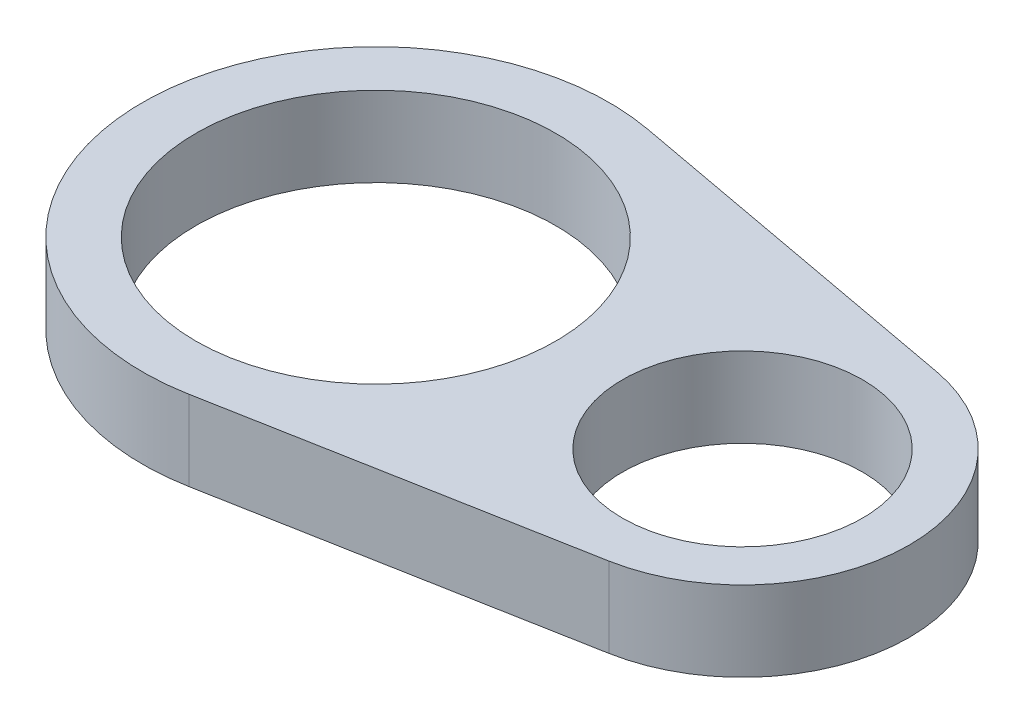
ISO-10303-21;
HEADER;
FILE_DESCRIPTION(('STEP AP214'),'2;1');
FILE_NAME('part.step','',(''),(''),'','','');
FILE_SCHEMA(('AUTOMOTIVE_DESIGN { 1 0 10303 214 1 1 1 1 }'));
ENDSEC;
DATA;
#1=APPLICATION_CONTEXT('core data for automotive mechanical design processes');
#2=APPLICATION_PROTOCOL_DEFINITION('international standard','automotive_design',2000,#1);
#3=PRODUCT_CONTEXT('',#1,'mechanical');
#4=PRODUCT('Part','Part','',(#3));
#5=PRODUCT_RELATED_PRODUCT_CATEGORY('part','',(#4));
#6=PRODUCT_DEFINITION_FORMATION('','',#4);
#7=PRODUCT_DEFINITION_CONTEXT('part definition',#1,'design');
#8=PRODUCT_DEFINITION('design','',#6,#7);
#9=PRODUCT_DEFINITION_SHAPE('','',#8);
#10=(LENGTH_UNIT() NAMED_UNIT(*) SI_UNIT(.MILLI.,.METRE.));
#11=(NAMED_UNIT(*) PLANE_ANGLE_UNIT() SI_UNIT($,.RADIAN.));
#12=(NAMED_UNIT(*) SI_UNIT($,.STERADIAN.) SOLID_ANGLE_UNIT());
#13=UNCERTAINTY_MEASURE_WITH_UNIT(LENGTH_MEASURE(1.E-05),#10,'distance_accuracy_value','');
#14=(GEOMETRIC_REPRESENTATION_CONTEXT(3) GLOBAL_UNCERTAINTY_ASSIGNED_CONTEXT((#13)) GLOBAL_UNIT_ASSIGNED_CONTEXT((#10,
#11,#12)) REPRESENTATION_CONTEXT('',''));
#15=CARTESIAN_POINT('',(0.,0.,0.));
#16=DIRECTION('',(0.,0.,1.));
#17=DIRECTION('',(1.,0.,0.));
#18=AXIS2_PLACEMENT_3D('',#15,#16,#17);
#19=CARTESIAN_POINT('',(0.,12.,0.));
#20=DIRECTION('',(0.,-1.,0.));
#21=DIRECTION('',(0.,0.,-1.));
#22=AXIS2_PLACEMENT_3D('',#19,#20,#21);
#23=CYLINDRICAL_SURFACE('',#22,35.);
#24=DIRECTION('',(0.,-1.,0.));
#25=VECTOR('',#24,1.);
#26=CARTESIAN_POINT('',(6.36363636363637,12.,34.4166258112472));
#27=LINE('',#26,#25);
#28=CARTESIAN_POINT('',(6.36363636363637,12.,34.4166258112472));
#29=VERTEX_POINT('',#28);
#30=CARTESIAN_POINT('',(6.36363636363637,0.,34.4166258112472));
#31=VERTEX_POINT('',#30);
#32=EDGE_CURVE('E119',#29,#31,#27,.T.);
#33=ORIENTED_EDGE('',*,*,#32,.F.);
#34=CARTESIAN_POINT('',(0.,12.,0.));
#35=DIRECTION('',(0.,1.,0.));
#36=DIRECTION('',(0.,0.,1.));
#37=AXIS2_PLACEMENT_3D('',#34,#35,#36);
#38=CIRCLE('',#37,35.);
#39=CARTESIAN_POINT('',(6.36363636363637,12.,-34.4166258112472));
#40=VERTEX_POINT('',#39);
#41=EDGE_CURVE('E11',#40,#29,#38,.T.);
#42=ORIENTED_EDGE('',*,*,#41,.F.);
#43=DIRECTION('',(0.,-1.,0.));
#44=VECTOR('',#43,1.);
#45=CARTESIAN_POINT('',(6.36363636363637,12.,-34.4166258112472));
#46=LINE('',#45,#44);
#47=CARTESIAN_POINT('',(6.36363636363637,0.,-34.4166258112472));
#48=VERTEX_POINT('',#47);
#49=EDGE_CURVE('E89',#40,#48,#46,.T.);
#50=ORIENTED_EDGE('',*,*,#49,.T.);
#51=CARTESIAN_POINT('',(0.,0.,0.));
#52=DIRECTION('',(0.,1.,0.));
#53=DIRECTION('',(0.,0.,1.));
#54=AXIS2_PLACEMENT_3D('',#51,#52,#53);
#55=CIRCLE('',#54,35.);
#56=EDGE_CURVE('E42',#48,#31,#55,.T.);
#57=ORIENTED_EDGE('',*,*,#56,.T.);
#58=EDGE_LOOP('',(#33,#42,#50,#57));
#59=FACE_BOUND('',#58,.T.);
#60=ADVANCED_FACE('F39',(#59),#23,.T.);
#61=CARTESIAN_POINT('',(0.,12.,0.));
#62=DIRECTION('',(0.,1.,0.));
#63=DIRECTION('',(0.,0.,1.));
#64=AXIS2_PLACEMENT_3D('',#61,#62,#63);
#65=PLANE('',#64);
#66=ORIENTED_EDGE('',*,*,#41,.T.);
#67=DIRECTION('',(-0.983332166035633,0.,0.181818181818182));
#68=VECTOR('',#67,1.);
#69=CARTESIAN_POINT('',(6.36363636363637,12.,34.4166258112472));
#70=LINE('',#69,#68);
#71=CARTESIAN_POINT('',(59.5454545454545,12.,24.5833041508908));
#72=VERTEX_POINT('',#71);
#73=EDGE_CURVE('E97',#72,#29,#70,.T.);
#74=ORIENTED_EDGE('',*,*,#73,.F.);
#75=CARTESIAN_POINT('',(55.,12.,0.));
#76=DIRECTION('',(0.,-1.,0.));
#77=DIRECTION('',(0.,0.,-1.));
#78=AXIS2_PLACEMENT_3D('',#75,#76,#77);
#79=CIRCLE('',#78,25.);
#80=CARTESIAN_POINT('',(59.5454545454545,12.,-24.5833041508908));
#81=VERTEX_POINT('',#80);
#82=EDGE_CURVE('E79',#81,#72,#79,.T.);
#83=ORIENTED_EDGE('',*,*,#82,.F.);
#84=DIRECTION('',(0.983332166035633,0.,0.181818181818182));
#85=VECTOR('',#84,1.);
#86=CARTESIAN_POINT('',(6.36363636363637,12.,-34.4166258112472));
#87=LINE('',#86,#85);
#88=EDGE_CURVE('E95',#40,#81,#87,.T.);
#89=ORIENTED_EDGE('',*,*,#88,.F.);
#90=EDGE_LOOP('',(#66,#74,#83,#89));
#91=FACE_BOUND('',#90,.T.);
#92=CARTESIAN_POINT('',(0.,12.,0.));
#93=DIRECTION('',(0.,1.,0.));
#94=DIRECTION('',(0.,0.,1.));
#95=AXIS2_PLACEMENT_3D('',#92,#93,#94);
#96=CIRCLE('',#95,27.);
#97=CARTESIAN_POINT('',(0.,12.,27.));
#98=VERTEX_POINT('',#97);
#99=EDGE_CURVE('E127',#98,#98,#96,.T.);
#100=ORIENTED_EDGE('',*,*,#99,.F.);
#101=EDGE_LOOP('',(#100));
#102=FACE_BOUND('',#101,.T.);
#103=CARTESIAN_POINT('',(55.,12.,0.));
#104=DIRECTION('',(0.,-1.,0.));
#105=DIRECTION('',(0.,0.,-1.));
#106=AXIS2_PLACEMENT_3D('',#103,#104,#105);
#107=CIRCLE('',#106,18.);
#108=CARTESIAN_POINT('',(55.,12.,-18.));
#109=VERTEX_POINT('',#108);
#110=EDGE_CURVE('E116',#109,#109,#107,.T.);
#111=ORIENTED_EDGE('',*,*,#110,.T.);
#112=EDGE_LOOP('',(#111));
#113=FACE_BOUND('',#112,.T.);
#114=ADVANCED_FACE('F93',(#91,#102,#113),#65,.T.);
#115=CARTESIAN_POINT('',(0.,0.,0.));
#116=DIRECTION('',(0.,1.,0.));
#117=DIRECTION('',(0.,0.,1.));
#118=AXIS2_PLACEMENT_3D('',#115,#116,#117);
#119=PLANE('',#118);
#120=ORIENTED_EDGE('',*,*,#56,.F.);
#121=DIRECTION('',(0.983332166035633,0.,0.181818181818182));
#122=VECTOR('',#121,1.);
#123=CARTESIAN_POINT('',(6.36363636363637,0.,-34.4166258112472));
#124=LINE('',#123,#122);
#125=CARTESIAN_POINT('',(59.5454545454545,0.,-24.5833041508908));
#126=VERTEX_POINT('',#125);
#127=EDGE_CURVE('E113',#48,#126,#124,.T.);
#128=ORIENTED_EDGE('',*,*,#127,.T.);
#129=CARTESIAN_POINT('',(55.,0.,0.));
#130=DIRECTION('',(0.,-1.,0.));
#131=DIRECTION('',(0.,0.,-1.));
#132=AXIS2_PLACEMENT_3D('',#129,#130,#131);
#133=CIRCLE('',#132,25.);
#134=CARTESIAN_POINT('',(59.5454545454545,0.,24.5833041508908));
#135=VERTEX_POINT('',#134);
#136=EDGE_CURVE('E82',#126,#135,#133,.T.);
#137=ORIENTED_EDGE('',*,*,#136,.T.);
#138=DIRECTION('',(-0.983332166035633,0.,0.181818181818182));
#139=VECTOR('',#138,1.);
#140=CARTESIAN_POINT('',(6.36363636363637,0.,34.4166258112472));
#141=LINE('',#140,#139);
#142=EDGE_CURVE('E102',#135,#31,#141,.T.);
#143=ORIENTED_EDGE('',*,*,#142,.T.);
#144=EDGE_LOOP('',(#120,#128,#137,#143));
#145=FACE_BOUND('',#144,.T.);
#146=CARTESIAN_POINT('',(0.,0.,0.));
#147=DIRECTION('',(0.,1.,0.));
#148=DIRECTION('',(0.,0.,1.));
#149=AXIS2_PLACEMENT_3D('',#146,#147,#148);
#150=CIRCLE('',#149,27.);
#151=CARTESIAN_POINT('',(0.,0.,27.));
#152=VERTEX_POINT('',#151);
#153=EDGE_CURVE('E122',#152,#152,#150,.T.);
#154=ORIENTED_EDGE('',*,*,#153,.T.);
#155=EDGE_LOOP('',(#154));
#156=FACE_BOUND('',#155,.T.);
#157=CARTESIAN_POINT('',(55.,0.,0.));
#158=DIRECTION('',(0.,-1.,0.));
#159=DIRECTION('',(0.,0.,-1.));
#160=AXIS2_PLACEMENT_3D('',#157,#158,#159);
#161=CIRCLE('',#160,18.);
#162=CARTESIAN_POINT('',(55.,0.,-18.));
#163=VERTEX_POINT('',#162);
#164=EDGE_CURVE('E108',#163,#163,#161,.T.);
#165=ORIENTED_EDGE('',*,*,#164,.F.);
#166=EDGE_LOOP('',(#165));
#167=FACE_BOUND('',#166,.T.);
#168=ADVANCED_FACE('F135',(#145,#156,#167),#119,.F.);
#169=CARTESIAN_POINT('',(0.,12.,0.));
#170=DIRECTION('',(0.,-1.,0.));
#171=DIRECTION('',(0.,0.,-1.));
#172=AXIS2_PLACEMENT_3D('',#169,#170,#171);
#173=CYLINDRICAL_SURFACE('',#172,27.);
#174=ORIENTED_EDGE('',*,*,#99,.T.);
#175=EDGE_LOOP('',(#174));
#176=FACE_BOUND('',#175,.T.);
#177=ORIENTED_EDGE('',*,*,#153,.F.);
#178=EDGE_LOOP('',(#177));
#179=FACE_BOUND('',#178,.T.);
#180=ADVANCED_FACE('F138',(#176,#179),#173,.F.);
#181=CARTESIAN_POINT('',(6.36363636363637,12.,34.4166258112472));
#182=DIRECTION('',(0.181818181818182,0.,0.983332166035633));
#183=DIRECTION('',(0.983332166035634,0.,-0.181818181818182));
#184=AXIS2_PLACEMENT_3D('',#181,#182,#183);
#185=PLANE('',#184);
#186=ORIENTED_EDGE('',*,*,#142,.F.);
#187=DIRECTION('',(0.,-1.,0.));
#188=VECTOR('',#187,1.);
#189=CARTESIAN_POINT('',(59.5454545454545,12.,24.5833041508908));
#190=LINE('',#189,#188);
#191=EDGE_CURVE('E88',#72,#135,#190,.T.);
#192=ORIENTED_EDGE('',*,*,#191,.F.);
#193=ORIENTED_EDGE('',*,*,#73,.T.);
#194=ORIENTED_EDGE('',*,*,#32,.T.);
#195=EDGE_LOOP('',(#186,#192,#193,#194));
#196=FACE_BOUND('',#195,.T.);
#197=ADVANCED_FACE('F140',(#196),#185,.T.);
#198=CARTESIAN_POINT('',(55.,12.,0.));
#199=DIRECTION('',(0.,-1.,0.));
#200=DIRECTION('',(0.,0.,-1.));
#201=AXIS2_PLACEMENT_3D('',#198,#199,#200);
#202=CYLINDRICAL_SURFACE('',#201,25.);
#203=ORIENTED_EDGE('',*,*,#136,.F.);
#204=DIRECTION('',(0.,-1.,0.));
#205=VECTOR('',#204,1.);
#206=CARTESIAN_POINT('',(59.5454545454545,12.,-24.5833041508908));
#207=LINE('',#206,#205);
#208=EDGE_CURVE('E76',#81,#126,#207,.T.);
#209=ORIENTED_EDGE('',*,*,#208,.F.);
#210=ORIENTED_EDGE('',*,*,#82,.T.);
#211=ORIENTED_EDGE('',*,*,#191,.T.);
#212=EDGE_LOOP('',(#203,#209,#210,#211));
#213=FACE_BOUND('',#212,.T.);
#214=ADVANCED_FACE('F78',(#213),#202,.T.);
#215=CARTESIAN_POINT('',(6.36363636363637,12.,-34.4166258112472));
#216=DIRECTION('',(0.181818181818182,0.,-0.983332166035633));
#217=DIRECTION('',(-0.983332166035634,0.,-0.181818181818182));
#218=AXIS2_PLACEMENT_3D('',#215,#216,#217);
#219=PLANE('',#218);
#220=ORIENTED_EDGE('',*,*,#127,.F.);
#221=ORIENTED_EDGE('',*,*,#49,.F.);
#222=ORIENTED_EDGE('',*,*,#88,.T.);
#223=ORIENTED_EDGE('',*,*,#208,.T.);
#224=EDGE_LOOP('',(#220,#221,#222,#223));
#225=FACE_BOUND('',#224,.T.);
#226=ADVANCED_FACE('F100',(#225),#219,.T.);
#227=CARTESIAN_POINT('',(55.,12.,0.));
#228=DIRECTION('',(0.,-1.,0.));
#229=DIRECTION('',(0.,0.,-1.));
#230=AXIS2_PLACEMENT_3D('',#227,#228,#229);
#231=CYLINDRICAL_SURFACE('',#230,18.);
#232=ORIENTED_EDGE('',*,*,#110,.F.);
#233=EDGE_LOOP('',(#232));
#234=FACE_BOUND('',#233,.T.);
#235=ORIENTED_EDGE('',*,*,#164,.T.);
#236=EDGE_LOOP('',(#235));
#237=FACE_BOUND('',#236,.T.);
#238=ADVANCED_FACE('F188',(#234,#237),#231,.F.);
#239=CLOSED_SHELL('',(#60,#114,#168,#180,#197,#214,#226,#238));
#240=MANIFOLD_SOLID_BREP('B2',#239);
#241=ADVANCED_BREP_SHAPE_REPRESENTATION('',(#18,#240),#14);
#242=SHAPE_DEFINITION_REPRESENTATION(#9,#241);
ENDSEC;
END-ISO-10303-21;
